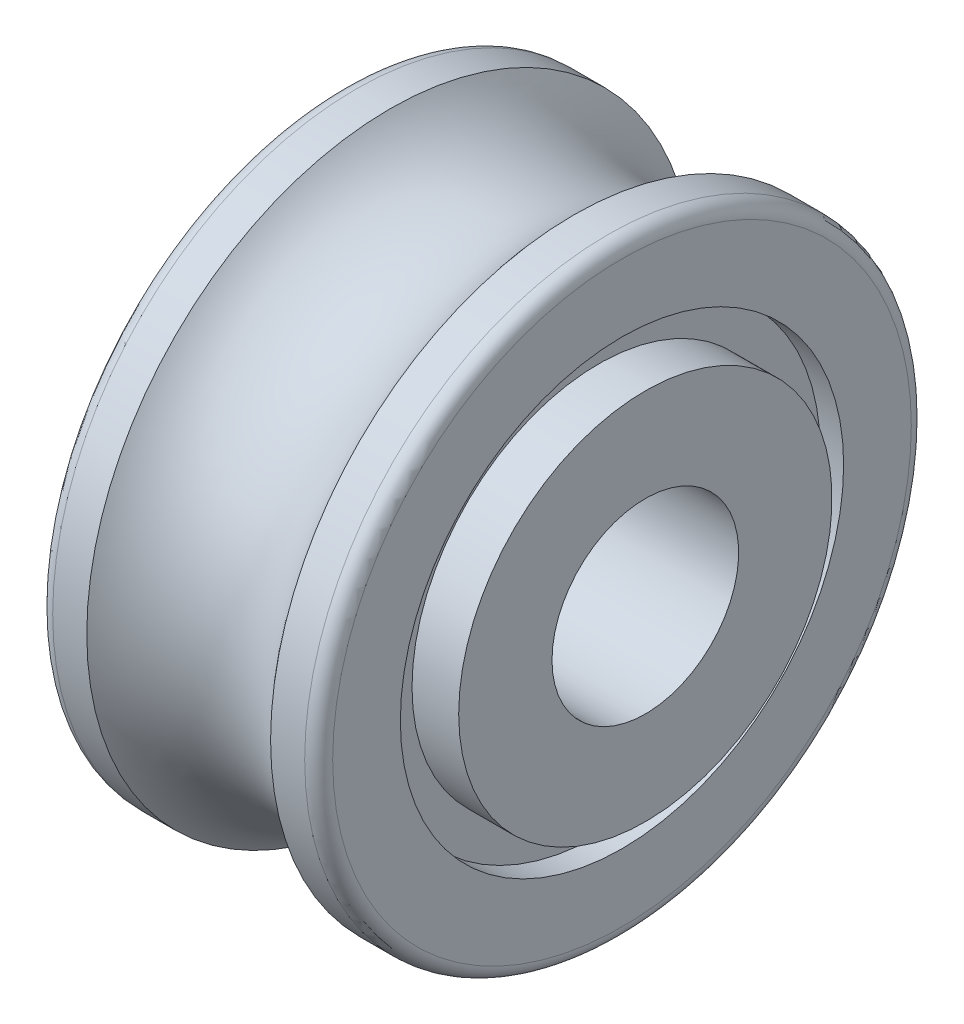
ISO-10303-21;
HEADER;
FILE_DESCRIPTION(('STEP AP214'),'2;1');
FILE_NAME('part.step','',(''),(''),'','','');
FILE_SCHEMA(('AUTOMOTIVE_DESIGN { 1 0 10303 214 1 1 1 1 }'));
ENDSEC;
DATA;
#1=APPLICATION_CONTEXT('core data for automotive mechanical design processes');
#2=APPLICATION_PROTOCOL_DEFINITION('international standard','automotive_design',2000,#1);
#3=PRODUCT_CONTEXT('',#1,'mechanical');
#4=PRODUCT('Part','Part','',(#3));
#5=PRODUCT_RELATED_PRODUCT_CATEGORY('part','',(#4));
#6=PRODUCT_DEFINITION_FORMATION('','',#4);
#7=PRODUCT_DEFINITION_CONTEXT('part definition',#1,'design');
#8=PRODUCT_DEFINITION('design','',#6,#7);
#9=PRODUCT_DEFINITION_SHAPE('','',#8);
#10=(LENGTH_UNIT() NAMED_UNIT(*) SI_UNIT(.MILLI.,.METRE.));
#11=(NAMED_UNIT(*) PLANE_ANGLE_UNIT() SI_UNIT($,.RADIAN.));
#12=(NAMED_UNIT(*) SI_UNIT($,.STERADIAN.) SOLID_ANGLE_UNIT());
#13=UNCERTAINTY_MEASURE_WITH_UNIT(LENGTH_MEASURE(1.E-05),#10,'distance_accuracy_value','');
#14=(GEOMETRIC_REPRESENTATION_CONTEXT(3) GLOBAL_UNCERTAINTY_ASSIGNED_CONTEXT((#13)) GLOBAL_UNIT_ASSIGNED_CONTEXT((#10,
#11,#12)) REPRESENTATION_CONTEXT('',''));
#15=CARTESIAN_POINT('',(0.,0.,0.));
#16=DIRECTION('',(0.,0.,1.));
#17=DIRECTION('',(1.,0.,0.));
#18=AXIS2_PLACEMENT_3D('',#15,#16,#17);
#19=CARTESIAN_POINT('',(0.,0.,0.));
#20=DIRECTION('',(-1.,0.,0.));
#21=DIRECTION('',(0.,0.,1.));
#22=AXIS2_PLACEMENT_3D('',#19,#20,#21);
#23=CYLINDRICAL_SURFACE('',#22,6.5);
#24=CARTESIAN_POINT('',(2.7,0.,0.));
#25=DIRECTION('',(-1.,0.,0.));
#26=DIRECTION('',(0.,0.,1.));
#27=AXIS2_PLACEMENT_3D('',#24,#25,#26);
#28=CIRCLE('',#27,6.5);
#29=CARTESIAN_POINT('',(2.7,0.,6.5));
#30=VERTEX_POINT('',#29);
#31=EDGE_CURVE('E47',#30,#30,#28,.T.);
#32=ORIENTED_EDGE('',*,*,#31,.T.);
#33=EDGE_LOOP('',(#32));
#34=FACE_BOUND('',#33,.T.);
#35=CARTESIAN_POINT('',(1.96936538001459,0.,0.));
#36=DIRECTION('',(-1.,0.,0.));
#37=DIRECTION('',(0.,0.,1.));
#38=AXIS2_PLACEMENT_3D('',#35,#36,#37);
#39=CIRCLE('',#38,6.5);
#40=CARTESIAN_POINT('',(1.96936538001459,0.,6.5));
#41=VERTEX_POINT('',#40);
#42=EDGE_CURVE('E53',#41,#41,#39,.F.);
#43=ORIENTED_EDGE('',*,*,#42,.T.);
#44=EDGE_LOOP('',(#43));
#45=FACE_BOUND('',#44,.T.);
#46=ADVANCED_FACE('F32',(#34,#45),#23,.T.);
#47=CARTESIAN_POINT('',(-3.5,0.,-2.));
#48=DIRECTION('',(1.,0.,0.));
#49=DIRECTION('',(0.,0.,-1.));
#50=AXIS2_PLACEMENT_3D('',#47,#48,#49);
#51=PLANE('',#50);
#52=CARTESIAN_POINT('',(-3.5,0.,0.));
#53=DIRECTION('',(-1.,0.,0.));
#54=DIRECTION('',(0.,0.,1.));
#55=AXIS2_PLACEMENT_3D('',#52,#53,#54);
#56=CIRCLE('',#55,2.);
#57=CARTESIAN_POINT('',(-3.5,0.,2.));
#58=VERTEX_POINT('',#57);
#59=EDGE_CURVE('E56',#58,#58,#56,.T.);
#60=ORIENTED_EDGE('',*,*,#59,.F.);
#61=EDGE_LOOP('',(#60));
#62=FACE_BOUND('',#61,.T.);
#63=CARTESIAN_POINT('',(-3.5,0.,0.));
#64=DIRECTION('',(-1.,0.,0.));
#65=DIRECTION('',(0.,0.,1.));
#66=AXIS2_PLACEMENT_3D('',#63,#64,#65);
#67=CIRCLE('',#66,4.);
#68=CARTESIAN_POINT('',(-3.5,0.,4.));
#69=VERTEX_POINT('',#68);
#70=EDGE_CURVE('E52',#69,#69,#67,.T.);
#71=ORIENTED_EDGE('',*,*,#70,.T.);
#72=EDGE_LOOP('',(#71));
#73=FACE_BOUND('',#72,.T.);
#74=ADVANCED_FACE('F91',(#62,#73),#51,.F.);
#75=CARTESIAN_POINT('',(0.,0.,0.));
#76=DIRECTION('',(-1.,0.,0.));
#77=DIRECTION('',(0.,0.,1.));
#78=AXIS2_PLACEMENT_3D('',#75,#76,#77);
#79=CYLINDRICAL_SURFACE('',#78,4.);
#80=ORIENTED_EDGE('',*,*,#70,.F.);
#81=EDGE_LOOP('',(#80));
#82=FACE_BOUND('',#81,.T.);
#83=CARTESIAN_POINT('',(-2.5,0.,0.));
#84=DIRECTION('',(-1.,0.,0.));
#85=DIRECTION('',(0.,0.,1.));
#86=AXIS2_PLACEMENT_3D('',#83,#84,#85);
#87=CIRCLE('',#86,4.);
#88=CARTESIAN_POINT('',(-2.5,0.,4.));
#89=VERTEX_POINT('',#88);
#90=EDGE_CURVE('E62',#89,#89,#87,.T.);
#91=ORIENTED_EDGE('',*,*,#90,.T.);
#92=EDGE_LOOP('',(#91));
#93=FACE_BOUND('',#92,.T.);
#94=ADVANCED_FACE('F94',(#82,#93),#79,.T.);
#95=CARTESIAN_POINT('',(-2.5,0.,-4.));
#96=DIRECTION('',(1.,0.,0.));
#97=DIRECTION('',(0.,0.,-1.));
#98=AXIS2_PLACEMENT_3D('',#95,#96,#97);
#99=PLANE('',#98);
#100=ORIENTED_EDGE('',*,*,#90,.F.);
#101=EDGE_LOOP('',(#100));
#102=FACE_BOUND('',#101,.T.);
#103=CARTESIAN_POINT('',(-2.5,0.,0.));
#104=DIRECTION('',(-1.,0.,0.));
#105=DIRECTION('',(0.,0.,1.));
#106=AXIS2_PLACEMENT_3D('',#103,#104,#105);
#107=CIRCLE('',#106,4.75);
#108=CARTESIAN_POINT('',(-2.5,0.,4.75));
#109=VERTEX_POINT('',#108);
#110=EDGE_CURVE('E65',#109,#109,#107,.T.);
#111=ORIENTED_EDGE('',*,*,#110,.T.);
#112=EDGE_LOOP('',(#111));
#113=FACE_BOUND('',#112,.T.);
#114=ADVANCED_FACE('F100',(#102,#113),#99,.F.);
#115=CARTESIAN_POINT('',(0.,0.,0.));
#116=DIRECTION('',(-1.,0.,0.));
#117=DIRECTION('',(0.,0.,1.));
#118=AXIS2_PLACEMENT_3D('',#115,#116,#117);
#119=CYLINDRICAL_SURFACE('',#118,4.75);
#120=ORIENTED_EDGE('',*,*,#110,.F.);
#121=EDGE_LOOP('',(#120));
#122=FACE_BOUND('',#121,.T.);
#123=CARTESIAN_POINT('',(-3.,0.,0.));
#124=DIRECTION('',(-1.,0.,0.));
#125=DIRECTION('',(0.,0.,1.));
#126=AXIS2_PLACEMENT_3D('',#123,#124,#125);
#127=CIRCLE('',#126,4.75);
#128=CARTESIAN_POINT('',(-3.,0.,4.75));
#129=VERTEX_POINT('',#128);
#130=EDGE_CURVE('E68',#129,#129,#127,.T.);
#131=ORIENTED_EDGE('',*,*,#130,.T.);
#132=EDGE_LOOP('',(#131));
#133=FACE_BOUND('',#132,.T.);
#134=ADVANCED_FACE('F106',(#122,#133),#119,.F.);
#135=CARTESIAN_POINT('',(-3.,0.,-4.75));
#136=DIRECTION('',(1.,0.,0.));
#137=DIRECTION('',(0.,0.,-1.));
#138=AXIS2_PLACEMENT_3D('',#135,#136,#137);
#139=PLANE('',#138);
#140=CARTESIAN_POINT('',(-3.,0.,0.));
#141=DIRECTION('',(1.,0.,0.));
#142=DIRECTION('',(0.,0.,-1.));
#143=AXIS2_PLACEMENT_3D('',#140,#141,#142);
#144=CIRCLE('',#143,6.2);
#145=CARTESIAN_POINT('',(-3.,0.,-6.2));
#146=VERTEX_POINT('',#145);
#147=EDGE_CURVE('E39',#146,#146,#144,.F.);
#148=ORIENTED_EDGE('',*,*,#147,.T.);
#149=EDGE_LOOP('',(#148));
#150=FACE_BOUND('',#149,.T.);
#151=ORIENTED_EDGE('',*,*,#130,.F.);
#152=EDGE_LOOP('',(#151));
#153=FACE_BOUND('',#152,.T.);
#154=ADVANCED_FACE('F112',(#150,#153),#139,.F.);
#155=CARTESIAN_POINT('',(-2.7,0.,0.));
#156=DIRECTION('',(1.,0.,0.));
#157=DIRECTION('',(0.,0.,-1.));
#158=AXIS2_PLACEMENT_3D('',#155,#156,#157);
#159=CIRCLE('',#158,6.5);
#160=CARTESIAN_POINT('',(-2.7,0.,-6.5));
#161=VERTEX_POINT('',#160);
#162=EDGE_CURVE('E10',#161,#161,#159,.T.);
#163=ORIENTED_EDGE('',*,*,#162,.T.);
#164=EDGE_LOOP('',(#163));
#165=FACE_BOUND('',#164,.T.);
#166=CARTESIAN_POINT('',(-1.96936538001459,0.,0.));
#167=DIRECTION('',(1.,0.,0.));
#168=DIRECTION('',(0.,0.,-1.));
#169=AXIS2_PLACEMENT_3D('',#166,#167,#168);
#170=CIRCLE('',#169,6.5);
#171=CARTESIAN_POINT('',(-1.96936538001459,0.,-6.5));
#172=VERTEX_POINT('',#171);
#173=EDGE_CURVE('E57',#172,#172,#170,.F.);
#174=ORIENTED_EDGE('',*,*,#173,.T.);
#175=EDGE_LOOP('',(#174));
#176=FACE_BOUND('',#175,.T.);
#177=ADVANCED_FACE('F117',(#165,#176),#23,.T.);
#178=CARTESIAN_POINT('',(3.,0.,-4.75));
#179=DIRECTION('',(-1.,0.,0.));
#180=DIRECTION('',(0.,0.,1.));
#181=AXIS2_PLACEMENT_3D('',#178,#179,#180);
#182=PLANE('',#181);
#183=CARTESIAN_POINT('',(3.,0.,0.));
#184=DIRECTION('',(-1.,0.,0.));
#185=DIRECTION('',(0.,0.,1.));
#186=AXIS2_PLACEMENT_3D('',#183,#184,#185);
#187=CIRCLE('',#186,6.2);
#188=CARTESIAN_POINT('',(3.,0.,6.2));
#189=VERTEX_POINT('',#188);
#190=EDGE_CURVE('E43',#189,#189,#187,.F.);
#191=ORIENTED_EDGE('',*,*,#190,.T.);
#192=EDGE_LOOP('',(#191));
#193=FACE_BOUND('',#192,.T.);
#194=CARTESIAN_POINT('',(3.,0.,0.));
#195=DIRECTION('',(-1.,0.,0.));
#196=DIRECTION('',(0.,0.,1.));
#197=AXIS2_PLACEMENT_3D('',#194,#195,#196);
#198=CIRCLE('',#197,4.75);
#199=CARTESIAN_POINT('',(3.,0.,4.75));
#200=VERTEX_POINT('',#199);
#201=EDGE_CURVE('E71',#200,#200,#198,.T.);
#202=ORIENTED_EDGE('',*,*,#201,.T.);
#203=EDGE_LOOP('',(#202));
#204=FACE_BOUND('',#203,.T.);
#205=ADVANCED_FACE('F122',(#193,#204),#182,.F.);
#206=CARTESIAN_POINT('',(0.,0.,0.));
#207=DIRECTION('',(-1.,0.,0.));
#208=DIRECTION('',(0.,0.,1.));
#209=AXIS2_PLACEMENT_3D('',#206,#207,#208);
#210=CYLINDRICAL_SURFACE('',#209,4.75);
#211=ORIENTED_EDGE('',*,*,#201,.F.);
#212=EDGE_LOOP('',(#211));
#213=FACE_BOUND('',#212,.T.);
#214=CARTESIAN_POINT('',(2.5,0.,0.));
#215=DIRECTION('',(-1.,0.,0.));
#216=DIRECTION('',(0.,0.,1.));
#217=AXIS2_PLACEMENT_3D('',#214,#215,#216);
#218=CIRCLE('',#217,4.75);
#219=CARTESIAN_POINT('',(2.5,0.,4.75));
#220=VERTEX_POINT('',#219);
#221=EDGE_CURVE('E74',#220,#220,#218,.T.);
#222=ORIENTED_EDGE('',*,*,#221,.T.);
#223=EDGE_LOOP('',(#222));
#224=FACE_BOUND('',#223,.T.);
#225=ADVANCED_FACE('F132',(#213,#224),#210,.F.);
#226=CARTESIAN_POINT('',(2.5,0.,-4.));
#227=DIRECTION('',(-1.,0.,0.));
#228=DIRECTION('',(0.,0.,1.));
#229=AXIS2_PLACEMENT_3D('',#226,#227,#228);
#230=PLANE('',#229);
#231=ORIENTED_EDGE('',*,*,#221,.F.);
#232=EDGE_LOOP('',(#231));
#233=FACE_BOUND('',#232,.T.);
#234=CARTESIAN_POINT('',(2.5,0.,0.));
#235=DIRECTION('',(-1.,0.,0.));
#236=DIRECTION('',(0.,0.,1.));
#237=AXIS2_PLACEMENT_3D('',#234,#235,#236);
#238=CIRCLE('',#237,4.);
#239=CARTESIAN_POINT('',(2.5,0.,4.));
#240=VERTEX_POINT('',#239);
#241=EDGE_CURVE('E77',#240,#240,#238,.T.);
#242=ORIENTED_EDGE('',*,*,#241,.T.);
#243=EDGE_LOOP('',(#242));
#244=FACE_BOUND('',#243,.T.);
#245=ADVANCED_FACE('F136',(#233,#244),#230,.F.);
#246=CARTESIAN_POINT('',(0.,0.,0.));
#247=DIRECTION('',(-1.,0.,0.));
#248=DIRECTION('',(0.,0.,1.));
#249=AXIS2_PLACEMENT_3D('',#246,#247,#248);
#250=CYLINDRICAL_SURFACE('',#249,4.);
#251=ORIENTED_EDGE('',*,*,#241,.F.);
#252=EDGE_LOOP('',(#251));
#253=FACE_BOUND('',#252,.T.);
#254=CARTESIAN_POINT('',(3.5,0.,0.));
#255=DIRECTION('',(-1.,0.,0.));
#256=DIRECTION('',(0.,0.,1.));
#257=AXIS2_PLACEMENT_3D('',#254,#255,#256);
#258=CIRCLE('',#257,4.);
#259=CARTESIAN_POINT('',(3.5,0.,4.));
#260=VERTEX_POINT('',#259);
#261=EDGE_CURVE('E80',#260,#260,#258,.T.);
#262=ORIENTED_EDGE('',*,*,#261,.T.);
#263=EDGE_LOOP('',(#262));
#264=FACE_BOUND('',#263,.T.);
#265=ADVANCED_FACE('F140',(#253,#264),#250,.T.);
#266=CARTESIAN_POINT('',(3.5,0.,-2.));
#267=DIRECTION('',(-1.,0.,0.));
#268=DIRECTION('',(0.,0.,1.));
#269=AXIS2_PLACEMENT_3D('',#266,#267,#268);
#270=PLANE('',#269);
#271=ORIENTED_EDGE('',*,*,#261,.F.);
#272=EDGE_LOOP('',(#271));
#273=FACE_BOUND('',#272,.T.);
#274=CARTESIAN_POINT('',(3.5,0.,0.));
#275=DIRECTION('',(-1.,0.,0.));
#276=DIRECTION('',(0.,0.,1.));
#277=AXIS2_PLACEMENT_3D('',#274,#275,#276);
#278=CIRCLE('',#277,2.);
#279=CARTESIAN_POINT('',(3.5,0.,2.));
#280=VERTEX_POINT('',#279);
#281=EDGE_CURVE('E83',#280,#280,#278,.T.);
#282=ORIENTED_EDGE('',*,*,#281,.T.);
#283=EDGE_LOOP('',(#282));
#284=FACE_BOUND('',#283,.T.);
#285=ADVANCED_FACE('F144',(#273,#284),#270,.F.);
#286=CARTESIAN_POINT('',(0.,0.,0.));
#287=DIRECTION('',(-1.,0.,0.));
#288=DIRECTION('',(0.,0.,1.));
#289=AXIS2_PLACEMENT_3D('',#286,#287,#288);
#290=CYLINDRICAL_SURFACE('',#289,2.);
#291=ORIENTED_EDGE('',*,*,#281,.F.);
#292=EDGE_LOOP('',(#291));
#293=FACE_BOUND('',#292,.T.);
#294=ORIENTED_EDGE('',*,*,#59,.T.);
#295=EDGE_LOOP('',(#294));
#296=FACE_BOUND('',#295,.T.);
#297=ADVANCED_FACE('F89',(#293,#296),#290,.F.);
#298=CARTESIAN_POINT('',(0.,0.,0.));
#299=DIRECTION('',(1.,0.,0.));
#300=DIRECTION('',(0.,0.,-1.));
#301=AXIS2_PLACEMENT_3D('',#298,#299,#300);
#302=TOROIDAL_SURFACE('',#301,8.04,2.5);
#303=ORIENTED_EDGE('',*,*,#173,.F.);
#304=EDGE_LOOP('',(#303));
#305=FACE_BOUND('',#304,.T.);
#306=ORIENTED_EDGE('',*,*,#42,.F.);
#307=EDGE_LOOP('',(#306));
#308=FACE_BOUND('',#307,.T.);
#309=ADVANCED_FACE('F151',(#305,#308),#302,.F.);
#310=CARTESIAN_POINT('',(2.7,0.,0.));
#311=DIRECTION('',(-1.,0.,0.));
#312=DIRECTION('',(0.,0.,1.));
#313=AXIS2_PLACEMENT_3D('',#310,#311,#312);
#314=TOROIDAL_SURFACE('',#313,6.2,0.3);
#315=ORIENTED_EDGE('',*,*,#190,.F.);
#316=EDGE_LOOP('',(#315));
#317=FACE_BOUND('',#316,.T.);
#318=ORIENTED_EDGE('',*,*,#31,.F.);
#319=EDGE_LOOP('',(#318));
#320=FACE_BOUND('',#319,.T.);
#321=ADVANCED_FACE('F154',(#317,#320),#314,.T.);
#322=CARTESIAN_POINT('',(-2.7,0.,0.));
#323=DIRECTION('',(1.,0.,0.));
#324=DIRECTION('',(0.,0.,-1.));
#325=AXIS2_PLACEMENT_3D('',#322,#323,#324);
#326=TOROIDAL_SURFACE('',#325,6.2,0.3);
#327=ORIENTED_EDGE('',*,*,#162,.F.);
#328=EDGE_LOOP('',(#327));
#329=FACE_BOUND('',#328,.T.);
#330=ORIENTED_EDGE('',*,*,#147,.F.);
#331=EDGE_LOOP('',(#330));
#332=FACE_BOUND('',#331,.T.);
#333=ADVANCED_FACE('F34',(#329,#332),#326,.T.);
#334=CLOSED_SHELL('',(#46,#74,#94,#114,#134,#154,#177,#205,#225,#245,#265,#285,#297,#309,#321,#333));
#335=MANIFOLD_SOLID_BREP('B2',#334);
#336=ADVANCED_BREP_SHAPE_REPRESENTATION('',(#18,#335),#14);
#337=SHAPE_DEFINITION_REPRESENTATION(#9,#336);
ENDSEC;
END-ISO-10303-21;
